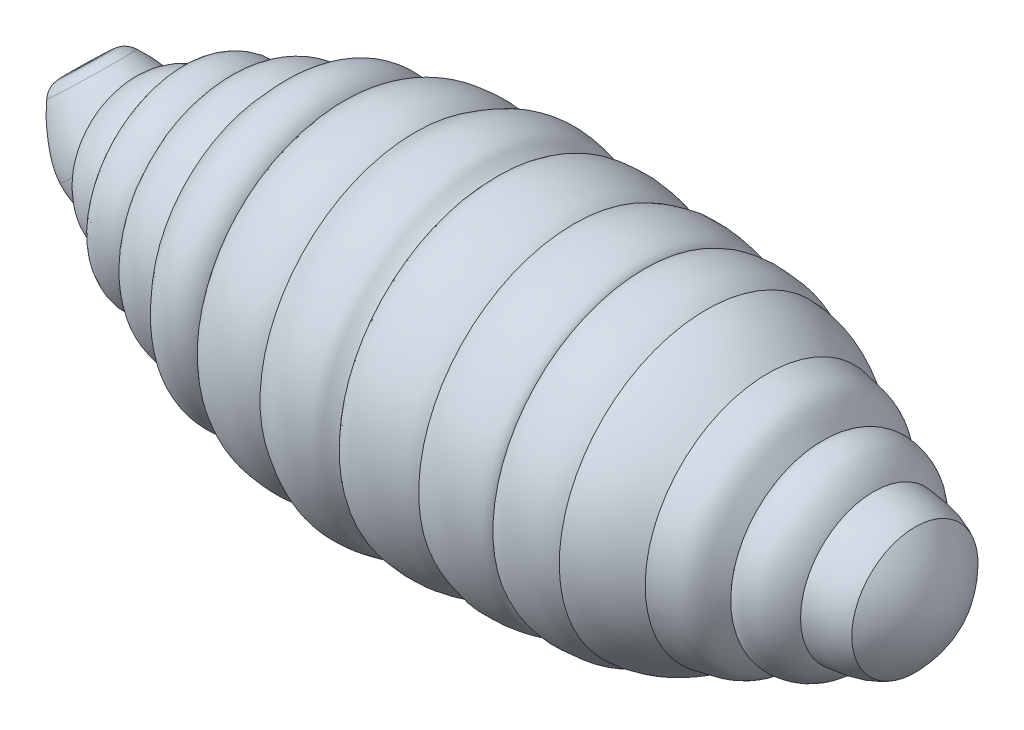
ISO-10303-21;
HEADER;
FILE_DESCRIPTION(('STEP AP214'),'2;1');
FILE_NAME('part.step','',(''),(''),'','','');
FILE_SCHEMA(('AUTOMOTIVE_DESIGN { 1 0 10303 214 1 1 1 1 }'));
ENDSEC;
DATA;
#1=APPLICATION_CONTEXT('core data for automotive mechanical design processes');
#2=APPLICATION_PROTOCOL_DEFINITION('international standard','automotive_design',2000,#1);
#3=PRODUCT_CONTEXT('',#1,'mechanical');
#4=PRODUCT('Part','Part','',(#3));
#5=PRODUCT_RELATED_PRODUCT_CATEGORY('part','',(#4));
#6=PRODUCT_DEFINITION_FORMATION('','',#4);
#7=PRODUCT_DEFINITION_CONTEXT('part definition',#1,'design');
#8=PRODUCT_DEFINITION('design','',#6,#7);
#9=PRODUCT_DEFINITION_SHAPE('','',#8);
#10=(LENGTH_UNIT() NAMED_UNIT(*) SI_UNIT(.MILLI.,.METRE.));
#11=(NAMED_UNIT(*) PLANE_ANGLE_UNIT() SI_UNIT($,.RADIAN.));
#12=(NAMED_UNIT(*) SI_UNIT($,.STERADIAN.) SOLID_ANGLE_UNIT());
#13=UNCERTAINTY_MEASURE_WITH_UNIT(LENGTH_MEASURE(1.E-05),#10,'distance_accuracy_value','');
#14=(GEOMETRIC_REPRESENTATION_CONTEXT(3) GLOBAL_UNCERTAINTY_ASSIGNED_CONTEXT((#13)) GLOBAL_UNIT_ASSIGNED_CONTEXT((#10,
#11,#12)) REPRESENTATION_CONTEXT('',''));
#15=CARTESIAN_POINT('',(0.,0.,0.));
#16=DIRECTION('',(0.,0.,1.));
#17=DIRECTION('',(1.,0.,0.));
#18=AXIS2_PLACEMENT_3D('',#15,#16,#17);
#19=CARTESIAN_POINT('',(-42.,0.,0.));
#20=DIRECTION('',(0.,0.,-1.));
#21=DIRECTION('',(1.,0.,0.));
#22=AXIS2_PLACEMENT_3D('',#19,#20,#21);
#23=SPHERICAL_SURFACE('',#22,6.5);
#24=CARTESIAN_POINT('',(-42.2629997102586,0.279961247403764,0.));
#25=DIRECTION('',(-0.684683498236419,0.728840522503201,0.));
#26=DIRECTION('',(-0.728840522503201,-0.684683498236419,0.));
#27=AXIS2_PLACEMENT_3D('',#24,#25,#26);
#28=CIRCLE('',#27,6.48864029303181);
#29=CARTESIAN_POINT('',(-42.,0.527027040369689,-6.47859880674159));
#30=VERTEX_POINT('',#29);
#31=CARTESIAN_POINT('',(-42.,0.52702704039308,6.47859880674012));
#32=VERTEX_POINT('',#31);
#33=EDGE_CURVE('E110',#30,#32,#28,.T.);
#34=ORIENTED_EDGE('',*,*,#33,.F.);
#35=CARTESIAN_POINT('',(-42.,0.,0.));
#36=DIRECTION('',(1.,0.,0.));
#37=DIRECTION('',(0.,1.,0.));
#38=AXIS2_PLACEMENT_3D('',#35,#36,#37);
#39=CIRCLE('',#38,6.5);
#40=CARTESIAN_POINT('',(-42.,-4.72764270550133,-4.4608737315822));
#41=VERTEX_POINT('',#40);
#42=EDGE_CURVE('E39',#41,#30,#39,.T.);
#43=ORIENTED_EDGE('',*,*,#42,.F.);
#44=CARTESIAN_POINT('',(-39.6407877272752,-2.51136402436704,0.));
#45=DIRECTION('',(-0.684683498236419,0.728840522503201,0.));
#46=DIRECTION('',(-0.728840522503201,-0.684683498236419,0.));
#47=AXIS2_PLACEMENT_3D('',#44,#45,#46);
#48=CIRCLE('',#47,5.51154861988351);
#49=CARTESIAN_POINT('',(-42.,-4.72764270550082,4.46087373158273));
#50=VERTEX_POINT('',#49);
#51=EDGE_CURVE('E61',#50,#41,#48,.F.);
#52=ORIENTED_EDGE('',*,*,#51,.F.);
#53=EDGE_CURVE('E96',#32,#50,#39,.T.);
#54=ORIENTED_EDGE('',*,*,#53,.F.);
#55=EDGE_LOOP('',(#34,#43,#52,#54));
#56=FACE_BOUND('',#55,.T.);
#57=ADVANCED_FACE('F35',(#56),#23,.T.);
#58=CARTESIAN_POINT('',(50.,0.,0.));
#59=CARTESIAN_POINT('',(49.9997063551662,1.83528020877926,0.));
#60=CARTESIAN_POINT('',(49.1652497316057,3.63930144569189,0.));
#61=CARTESIAN_POINT('',(48.3309716119096,5.44293677307604,0.));
#62=CARTESIAN_POINT('',(46.6888712468462,7.15708657704143,0.));
#63=B_SPLINE_CURVE_WITH_KNOTS('',2,(#58,#59,#60,#61,#62),.UNSPECIFIED.,.F.,.F.,(3,2,3),(0.,0.5,
1.),.UNSPECIFIED.);
#64=CARTESIAN_POINT('',(-50.,0.,0.));
#65=DIRECTION('',(-1.,0.,0.));
#66=AXIS1_PLACEMENT('',#64,#65);
#67=SURFACE_OF_REVOLUTION('',#63,#66);
#68=CARTESIAN_POINT('',(46.6888712468464,0.,0.));
#69=DIRECTION('',(-1.,0.,0.));
#70=DIRECTION('',(0.,1.,0.));
#71=AXIS2_PLACEMENT_3D('',#68,#69,#70);
#72=CIRCLE('',#71,7.15708657704127);
#73=CARTESIAN_POINT('',(46.6888712468464,7.15708657704127,0.));
#74=VERTEX_POINT('',#73);
#75=EDGE_CURVE('E192',#74,#74,#72,.T.);
#76=ORIENTED_EDGE('',*,*,#75,.F.);
#77=EDGE_LOOP('',(#76));
#78=FACE_BOUND('',#77,.T.);
#79=CARTESIAN_POINT('',(50.,0.,0.));
#80=VERTEX_POINT('',#79);
#81=VERTEX_LOOP('',#80);
#82=FACE_BOUND('',#81,.T.);
#83=ADVANCED_FACE('F168',(#78,#82),#67,.T.);
#84=CARTESIAN_POINT('',(42.,8.28104738789359,0.));
#85=CARTESIAN_POINT('',(43.5955919784813,8.09543828768739,0.));
#86=CARTESIAN_POINT('',(45.2531179201532,7.96065524423312,0.));
#87=CARTESIAN_POINT('',(46.6888712468464,7.15708657704127,0.));
#88=B_SPLINE_CURVE_WITH_KNOTS('',3,(#84,#85,#86,#87),.UNSPECIFIED.,.F.,.F.,(4,4),(0.,1.),.UNSPECIFIED.);
#89=CARTESIAN_POINT('',(-50.,0.,0.));
#90=DIRECTION('',(-1.,0.,0.));
#91=AXIS1_PLACEMENT('',#89,#90);
#92=SURFACE_OF_REVOLUTION('',#88,#91);
#93=ORIENTED_EDGE('',*,*,#75,.T.);
#94=EDGE_LOOP('',(#93));
#95=FACE_BOUND('',#94,.T.);
#96=CARTESIAN_POINT('',(42.,0.,0.));
#97=DIRECTION('',(-1.,0.,0.));
#98=DIRECTION('',(0.,-1.,0.));
#99=AXIS2_PLACEMENT_3D('',#96,#97,#98);
#100=CIRCLE('',#99,8.28104738789359);
#101=CARTESIAN_POINT('',(42.,-8.28104738789358,0.));
#102=VERTEX_POINT('',#101);
#103=EDGE_CURVE('E256',#102,#102,#100,.T.);
#104=ORIENTED_EDGE('',*,*,#103,.F.);
#105=EDGE_LOOP('',(#104));
#106=FACE_BOUND('',#105,.T.);
#107=ADVANCED_FACE('F172',(#95,#106),#92,.F.);
#108=CARTESIAN_POINT('',(36.,10.0967700152084,0.));
#109=CARTESIAN_POINT('',(36.1648997740849,10.4394423191181,0.));
#110=CARTESIAN_POINT('',(36.6963517795307,10.8691492370424,0.));
#111=CARTESIAN_POINT('',(37.745862760455,11.0782128664449,0.));
#112=CARTESIAN_POINT('',(38.6875001009525,10.8757792862498,0.));
#113=CARTESIAN_POINT('',(39.765691934058,10.5497597271227,0.));
#114=CARTESIAN_POINT('',(40.8970845261141,9.68208773770644,0.));
#115=CARTESIAN_POINT('',(41.6422223563437,8.85342200247426,0.));
#116=CARTESIAN_POINT('',(42.,8.28104738789359,0.));
#117=B_SPLINE_CURVE_WITH_KNOTS('',3,(#108,#109,#110,#111,#112,#113,#114,#115,#116),
.UNSPECIFIED.,.F.,.F.,(4,1,1,1,1,1,4),(0.,0.152464572931677,0.266191497924167,0.427434588880055,
0.541585927712012,0.725793911544838,1.),.UNSPECIFIED.);
#118=CARTESIAN_POINT('',(-50.,0.,0.));
#119=DIRECTION('',(-1.,0.,0.));
#120=AXIS1_PLACEMENT('',#118,#119);
#121=SURFACE_OF_REVOLUTION('',#117,#120);
#122=ORIENTED_EDGE('',*,*,#103,.T.);
#123=EDGE_LOOP('',(#122));
#124=FACE_BOUND('',#123,.T.);
#125=CARTESIAN_POINT('',(36.,0.,0.));
#126=DIRECTION('',(-1.,0.,0.));
#127=DIRECTION('',(0.,-1.,0.));
#128=AXIS2_PLACEMENT_3D('',#125,#126,#127);
#129=CIRCLE('',#128,10.0967700152084);
#130=CARTESIAN_POINT('',(36.,-10.0967700152084,0.));
#131=VERTEX_POINT('',#130);
#132=EDGE_CURVE('E253',#131,#131,#129,.T.);
#133=ORIENTED_EDGE('',*,*,#132,.F.);
#134=EDGE_LOOP('',(#133));
#135=FACE_BOUND('',#134,.T.);
#136=ADVANCED_FACE('F271',(#124,#135),#121,.F.);
#137=CARTESIAN_POINT('',(30.,13.9037401965799,0.));
#138=CARTESIAN_POINT('',(31.1983333416806,13.6198257245417,0.));
#139=CARTESIAN_POINT('',(34.0789157247043,13.5061248181912,0.));
#140=CARTESIAN_POINT('',(35.3497922038353,11.0047350326224,0.));
#141=CARTESIAN_POINT('',(36.,10.0967700152084,0.));
#142=B_SPLINE_CURVE_WITH_KNOTS('',3,(#137,#138,#139,#140,#141),.UNSPECIFIED.,.F.,.F.,(4,1,4),
(0.,0.529447084413405,1.),.UNSPECIFIED.);
#143=CARTESIAN_POINT('',(-50.,0.,0.));
#144=DIRECTION('',(-1.,0.,0.));
#145=AXIS1_PLACEMENT('',#143,#144);
#146=SURFACE_OF_REVOLUTION('',#142,#145);
#147=ORIENTED_EDGE('',*,*,#132,.T.);
#148=EDGE_LOOP('',(#147));
#149=FACE_BOUND('',#148,.T.);
#150=CARTESIAN_POINT('',(30.,0.,0.));
#151=DIRECTION('',(-1.,0.,0.));
#152=DIRECTION('',(0.,-1.,0.));
#153=AXIS2_PLACEMENT_3D('',#150,#151,#152);
#154=CIRCLE('',#153,13.9037401965799);
#155=CARTESIAN_POINT('',(30.,-13.9037401965799,0.));
#156=VERTEX_POINT('',#155);
#157=EDGE_CURVE('E250',#156,#156,#154,.T.);
#158=ORIENTED_EDGE('',*,*,#157,.F.);
#159=EDGE_LOOP('',(#158));
#160=FACE_BOUND('',#159,.T.);
#161=ADVANCED_FACE('F276',(#149,#160),#146,.F.);
#162=CARTESIAN_POINT('',(23.,16.6479798239174,0.));
#163=CARTESIAN_POINT('',(25.6210132962743,16.5633102642351,0.));
#164=CARTESIAN_POINT('',(27.9044349307184,15.3073779247023,0.));
#165=CARTESIAN_POINT('',(30.,13.9037401965799,0.));
#166=B_SPLINE_CURVE_WITH_KNOTS('',3,(#162,#163,#164,#165),.UNSPECIFIED.,.F.,.F.,(4,4),(0.,1.),.UNSPECIFIED.);
#167=CARTESIAN_POINT('',(-50.,0.,0.));
#168=DIRECTION('',(-1.,0.,0.));
#169=AXIS1_PLACEMENT('',#167,#168);
#170=SURFACE_OF_REVOLUTION('',#166,#169);
#171=ORIENTED_EDGE('',*,*,#157,.T.);
#172=EDGE_LOOP('',(#171));
#173=FACE_BOUND('',#172,.T.);
#174=CARTESIAN_POINT('',(23.,0.,0.));
#175=DIRECTION('',(-1.,0.,0.));
#176=DIRECTION('',(0.,-1.,0.));
#177=AXIS2_PLACEMENT_3D('',#174,#175,#176);
#178=CIRCLE('',#177,16.6479798239174);
#179=CARTESIAN_POINT('',(23.,-16.6479798239174,0.));
#180=VERTEX_POINT('',#179);
#181=EDGE_CURVE('E247',#180,#180,#178,.T.);
#182=ORIENTED_EDGE('',*,*,#181,.F.);
#183=EDGE_LOOP('',(#182));
#184=FACE_BOUND('',#183,.T.);
#185=ADVANCED_FACE('F281',(#173,#184),#170,.F.);
#186=CARTESIAN_POINT('',(16.,17.1727696263886,0.));
#187=CARTESIAN_POINT('',(16.4092306846909,17.3968524585221,0.));
#188=CARTESIAN_POINT('',(17.0185438711078,17.5894532577867,0.));
#189=CARTESIAN_POINT('',(17.9071210774252,17.6388000058519,0.));
#190=CARTESIAN_POINT('',(18.2046930613381,17.6823657132867,0.));
#191=CARTESIAN_POINT('',(18.607659449331,17.6808848623169,0.));
#192=CARTESIAN_POINT('',(18.9514869908962,17.6412399103501,0.));
#193=CARTESIAN_POINT('',(20.3135688490514,17.5548759143627,0.));
#194=CARTESIAN_POINT('',(21.4096312816424,17.4389186139164,0.));
#195=CARTESIAN_POINT('',(22.5448340930615,16.9224433203292,0.));
#196=CARTESIAN_POINT('',(23.,16.6479798239174,0.));
#197=B_SPLINE_CURVE_WITH_KNOTS('',3,(#186,#187,#188,#189,#190,#191,#192,#193,#194,#195,#196),
.UNSPECIFIED.,.F.,.F.,(4,1,1,1,1,1,1,1,4),(0.,0.20115166025893,0.294305631612312,
0.364002236395487,0.3814152572732,0.468435840389441,0.54569185567994,0.779325231246277,1.),.UNSPECIFIED.);
#198=CARTESIAN_POINT('',(-50.,0.,0.));
#199=DIRECTION('',(-1.,0.,0.));
#200=AXIS1_PLACEMENT('',#198,#199);
#201=SURFACE_OF_REVOLUTION('',#197,#200);
#202=ORIENTED_EDGE('',*,*,#181,.T.);
#203=EDGE_LOOP('',(#202));
#204=FACE_BOUND('',#203,.T.);
#205=CARTESIAN_POINT('',(16.,0.,0.));
#206=DIRECTION('',(-1.,0.,0.));
#207=DIRECTION('',(0.,-1.,0.));
#208=AXIS2_PLACEMENT_3D('',#205,#206,#207);
#209=CIRCLE('',#208,17.1727696263885);
#210=CARTESIAN_POINT('',(16.,-17.1727696263885,0.));
#211=VERTEX_POINT('',#210);
#212=EDGE_CURVE('E244',#211,#211,#209,.T.);
#213=ORIENTED_EDGE('',*,*,#212,.F.);
#214=EDGE_LOOP('',(#213));
#215=FACE_BOUND('',#214,.T.);
#216=ADVANCED_FACE('F287',(#204,#215),#201,.F.);
#217=CARTESIAN_POINT('',(7.99999999999998,17.58879558299,0.));
#218=CARTESIAN_POINT('',(8.58195172244521,17.8804159787155,0.));
#219=CARTESIAN_POINT('',(9.43998916263691,18.0527990013269,0.));
#220=CARTESIAN_POINT('',(10.5081521326243,18.3341251335839,0.));
#221=CARTESIAN_POINT('',(11.0618501999922,18.2976534538103,0.));
#222=CARTESIAN_POINT('',(11.5040455510617,18.2994251244907,0.));
#223=CARTESIAN_POINT('',(11.8663632179127,18.3093296074904,0.));
#224=CARTESIAN_POINT('',(12.2606155330468,18.2674280029491,0.));
#225=CARTESIAN_POINT('',(12.6390768169979,18.2311689979446,0.));
#226=CARTESIAN_POINT('',(12.9995380189958,18.1871859247805,0.));
#227=CARTESIAN_POINT('',(13.4294768607219,18.1315994240063,0.));
#228=CARTESIAN_POINT('',(14.0354190365389,18.0081948464241,0.));
#229=CARTESIAN_POINT('',(14.9736986439508,17.8254983824232,0.));
#230=CARTESIAN_POINT('',(15.7088977452917,17.5561704027527,0.));
#231=CARTESIAN_POINT('',(16.,17.1727696263885,0.));
#232=B_SPLINE_CURVE_WITH_KNOTS('',3,(#217,#218,#219,#220,#221,#222,#223,#224,#225,#226,#227,
#228,#229,#230,#231),.UNSPECIFIED.,.F.,.F.,(4,1,1,1,1,1,1,1,1,1,1,1,4),(0.,0.229372754582656,
0.317536007236325,0.393855893615315,0.427343111732747,0.476843965174335,0.524044558774018,
0.569820456887553,0.613701787293404,0.654707151740502,0.725801780216515,0.83593387589124,1.),.UNSPECIFIED.);
#233=CARTESIAN_POINT('',(-50.,0.,0.));
#234=DIRECTION('',(-1.,0.,0.));
#235=AXIS1_PLACEMENT('',#233,#234);
#236=SURFACE_OF_REVOLUTION('',#232,#235);
#237=ORIENTED_EDGE('',*,*,#212,.T.);
#238=EDGE_LOOP('',(#237));
#239=FACE_BOUND('',#238,.T.);
#240=CARTESIAN_POINT('',(7.99999999999999,0.,0.));
#241=DIRECTION('',(-1.,0.,0.));
#242=DIRECTION('',(0.,-1.,0.));
#243=AXIS2_PLACEMENT_3D('',#240,#241,#242);
#244=CIRCLE('',#243,17.58879558299);
#245=CARTESIAN_POINT('',(7.99999999999999,-17.58879558299,0.));
#246=VERTEX_POINT('',#245);
#247=EDGE_CURVE('E241',#246,#246,#244,.T.);
#248=ORIENTED_EDGE('',*,*,#247,.F.);
#249=EDGE_LOOP('',(#248));
#250=FACE_BOUND('',#249,.T.);
#251=ADVANCED_FACE('F293',(#239,#250),#236,.F.);
#252=CARTESIAN_POINT('',(-1.00000000000002,17.58879558299,0.));
#253=CARTESIAN_POINT('',(-0.614381517490259,18.1042013550658,0.));
#254=CARTESIAN_POINT('',(0.333735079944588,18.632641408761,0.));
#255=CARTESIAN_POINT('',(1.65279448140818,18.7237738313502,0.));
#256=CARTESIAN_POINT('',(2.53495210967577,18.794772533689,0.));
#257=CARTESIAN_POINT('',(3.2722451551941,18.7961807507217,0.));
#258=CARTESIAN_POINT('',(3.89160746997234,18.7458650543614,0.));
#259=CARTESIAN_POINT('',(4.47522000834908,18.667212173481,0.));
#260=CARTESIAN_POINT('',(4.99223252068978,18.5615601771135,0.));
#261=CARTESIAN_POINT('',(5.54256250629083,18.4666664859525,0.));
#262=CARTESIAN_POINT('',(6.11477590126522,18.2846224684002,0.));
#263=CARTESIAN_POINT('',(6.6811895763478,18.1832914009895,0.));
#264=CARTESIAN_POINT('',(7.33054937110865,17.9804058142008,0.));
#265=CARTESIAN_POINT('',(7.73759263743826,17.748797975174,0.));
#266=CARTESIAN_POINT('',(7.99999999999998,17.58879558299,0.));
#267=B_SPLINE_CURVE_WITH_KNOTS('',3,(#252,#253,#254,#255,#256,#257,#258,#259,#260,#261,#262,
#263,#264,#265,#266),.UNSPECIFIED.,.F.,.F.,(4,1,1,1,1,1,1,1,1,1,1,1,4),(0.,0.199993369543529,
0.323104104368617,0.414620343601679,0.47925154603547,0.555247359146551,0.610372734943505,
0.664792721977809,0.721612681011752,0.786226372903281,0.853650458042409,0.902782427386736,1.),.UNSPECIFIED.);
#268=CARTESIAN_POINT('',(-50.,0.,0.));
#269=DIRECTION('',(-1.,0.,0.));
#270=AXIS1_PLACEMENT('',#268,#269);
#271=SURFACE_OF_REVOLUTION('',#267,#270);
#272=ORIENTED_EDGE('',*,*,#247,.T.);
#273=EDGE_LOOP('',(#272));
#274=FACE_BOUND('',#273,.T.);
#275=CARTESIAN_POINT('',(-1.00000000000001,0.,0.));
#276=DIRECTION('',(-1.,0.,0.));
#277=DIRECTION('',(0.,-1.,0.));
#278=AXIS2_PLACEMENT_3D('',#275,#276,#277);
#279=CIRCLE('',#278,17.58879558299);
#280=CARTESIAN_POINT('',(-1.00000000000001,-17.58879558299,0.));
#281=VERTEX_POINT('',#280);
#282=EDGE_CURVE('E238',#281,#281,#279,.T.);
#283=ORIENTED_EDGE('',*,*,#282,.F.);
#284=EDGE_LOOP('',(#283));
#285=FACE_BOUND('',#284,.T.);
#286=ADVANCED_FACE('F299',(#274,#285),#271,.F.);
#287=CARTESIAN_POINT('',(-10.,17.58879558299,0.));
#288=CARTESIAN_POINT('',(-9.17764033625155,18.0865379526265,0.));
#289=CARTESIAN_POINT('',(-7.79833975548958,19.0069684286883,0.));
#290=CARTESIAN_POINT('',(-5.52354150623839,19.3180077940493,0.));
#291=CARTESIAN_POINT('',(-3.93611691289387,19.069156303444,0.));
#292=CARTESIAN_POINT('',(-2.28921186726228,18.7528788819492,0.));
#293=CARTESIAN_POINT('',(-1.61636299261944,17.8471970558595,0.));
#294=CARTESIAN_POINT('',(-1.00000000000002,17.58879558299,0.));
#295=B_SPLINE_CURVE_WITH_KNOTS('',3,(#287,#288,#289,#290,#291,#292,#293,#294),.UNSPECIFIED.,.F.,
.F.,(4,1,1,1,1,4),(0.,0.297871953056791,0.496695395077748,0.687344485397055,0.793867051889781,
1.),.UNSPECIFIED.);
#296=CARTESIAN_POINT('',(-50.,0.,0.));
#297=DIRECTION('',(-1.,0.,0.));
#298=AXIS1_PLACEMENT('',#296,#297);
#299=SURFACE_OF_REVOLUTION('',#295,#298);
#300=ORIENTED_EDGE('',*,*,#282,.T.);
#301=EDGE_LOOP('',(#300));
#302=FACE_BOUND('',#301,.T.);
#303=CARTESIAN_POINT('',(-10.,0.,0.));
#304=DIRECTION('',(-1.,0.,0.));
#305=DIRECTION('',(0.,-1.,0.));
#306=AXIS2_PLACEMENT_3D('',#303,#304,#305);
#307=CIRCLE('',#306,17.58879558299);
#308=CARTESIAN_POINT('',(-10.,-17.58879558299,0.));
#309=VERTEX_POINT('',#308);
#310=EDGE_CURVE('E235',#309,#309,#307,.T.);
#311=ORIENTED_EDGE('',*,*,#310,.F.);
#312=EDGE_LOOP('',(#311));
#313=FACE_BOUND('',#312,.T.);
#314=ADVANCED_FACE('F305',(#302,#313),#299,.F.);
#315=CARTESIAN_POINT('',(-19.,14.7813768868694,0.));
#316=CARTESIAN_POINT('',(-18.8759341950245,16.028850536088,0.));
#317=CARTESIAN_POINT('',(-17.5747081904575,17.2884400085088,0.));
#318=CARTESIAN_POINT('',(-15.5097710752355,18.0753626090936,0.));
#319=CARTESIAN_POINT('',(-14.0238921132705,18.2272210447954,0.));
#320=CARTESIAN_POINT('',(-12.1615104618129,18.3929705347466,0.));
#321=CARTESIAN_POINT('',(-10.7975743860364,18.0401145274624,0.));
#322=CARTESIAN_POINT('',(-10.,17.58879558299,0.));
#323=B_SPLINE_CURVE_WITH_KNOTS('',3,(#315,#316,#317,#318,#319,#320,#321,#322),.UNSPECIFIED.,.F.,
.F.,(4,1,1,1,1,4),(0.,0.324864627047122,0.474838109363639,0.616409351822741,0.743385769950866,
1.),.UNSPECIFIED.);
#324=CARTESIAN_POINT('',(-50.,0.,0.));
#325=DIRECTION('',(-1.,0.,0.));
#326=AXIS1_PLACEMENT('',#324,#325);
#327=SURFACE_OF_REVOLUTION('',#323,#326);
#328=ORIENTED_EDGE('',*,*,#310,.T.);
#329=EDGE_LOOP('',(#328));
#330=FACE_BOUND('',#329,.T.);
#331=CARTESIAN_POINT('',(-19.,0.,0.));
#332=DIRECTION('',(-1.,0.,0.));
#333=DIRECTION('',(0.,-1.,0.));
#334=AXIS2_PLACEMENT_3D('',#331,#332,#333);
#335=CIRCLE('',#334,14.7813768868694);
#336=CARTESIAN_POINT('',(-19.,-14.7813768868694,0.));
#337=VERTEX_POINT('',#336);
#338=EDGE_CURVE('E232',#337,#337,#335,.T.);
#339=ORIENTED_EDGE('',*,*,#338,.F.);
#340=EDGE_LOOP('',(#339));
#341=FACE_BOUND('',#340,.T.);
#342=ADVANCED_FACE('F311',(#330,#341),#327,.F.);
#343=CARTESIAN_POINT('',(-26.,13.9037401965799,0.));
#344=CARTESIAN_POINT('',(-25.2518993592873,14.6965988482443,0.));
#345=CARTESIAN_POINT('',(-24.2034123378488,16.1921795650815,0.));
#346=CARTESIAN_POINT('',(-22.1096612303888,16.6701797300599,0.));
#347=CARTESIAN_POINT('',(-20.3650098145285,16.3823642915235,0.));
#348=CARTESIAN_POINT('',(-19.344111288408,15.542594260465,0.));
#349=CARTESIAN_POINT('',(-19.,14.7813768868694,0.));
#350=B_SPLINE_CURVE_WITH_KNOTS('',3,(#343,#344,#345,#346,#347,#348,#349),.UNSPECIFIED.,.F.,.F.,
(4,1,1,1,4),(0.,0.396544676610702,0.574715816439164,0.715438823067215,1.),.UNSPECIFIED.);
#351=CARTESIAN_POINT('',(-50.,0.,0.));
#352=DIRECTION('',(-1.,0.,0.));
#353=AXIS1_PLACEMENT('',#351,#352);
#354=SURFACE_OF_REVOLUTION('',#350,#353);
#355=ORIENTED_EDGE('',*,*,#338,.T.);
#356=EDGE_LOOP('',(#355));
#357=FACE_BOUND('',#356,.T.);
#358=CARTESIAN_POINT('',(-26.,0.,0.));
#359=DIRECTION('',(-1.,0.,0.));
#360=DIRECTION('',(0.,-1.,0.));
#361=AXIS2_PLACEMENT_3D('',#358,#359,#360);
#362=CIRCLE('',#361,13.9037401965799);
#363=CARTESIAN_POINT('',(-26.,-13.9037401965799,0.));
#364=VERTEX_POINT('',#363);
#365=EDGE_CURVE('E227',#364,#364,#362,.T.);
#366=ORIENTED_EDGE('',*,*,#365,.F.);
#367=EDGE_LOOP('',(#366));
#368=FACE_BOUND('',#367,.T.);
#369=ADVANCED_FACE('F317',(#357,#368),#354,.F.);
#370=CARTESIAN_POINT('',(-32.,11.2075803757034,0.));
#371=CARTESIAN_POINT('',(-31.4638772632166,12.0955660328105,0.));
#372=CARTESIAN_POINT('',(-30.5043649253966,13.362444513894,0.));
#373=CARTESIAN_POINT('',(-28.2234485828988,14.2013610857232,0.));
#374=CARTESIAN_POINT('',(-26.870161366585,13.9918896528299,0.));
#375=CARTESIAN_POINT('',(-26.,13.9037401965799,0.));
#376=B_SPLINE_CURVE_WITH_KNOTS('',3,(#370,#371,#372,#373,#374,#375),.UNSPECIFIED.,.F.,.F.,(4,1,
1,4),(0.,0.44747716248506,0.624963351203104,1.),.UNSPECIFIED.);
#377=CARTESIAN_POINT('',(-50.,0.,0.));
#378=DIRECTION('',(-1.,0.,0.));
#379=AXIS1_PLACEMENT('',#377,#378);
#380=SURFACE_OF_REVOLUTION('',#376,#379);
#381=ORIENTED_EDGE('',*,*,#365,.T.);
#382=EDGE_LOOP('',(#381));
#383=FACE_BOUND('',#382,.T.);
#384=CARTESIAN_POINT('',(-32.,0.,0.));
#385=DIRECTION('',(-1.,0.,0.));
#386=DIRECTION('',(0.,-1.,0.));
#387=AXIS2_PLACEMENT_3D('',#384,#385,#386);
#388=CIRCLE('',#387,11.2075803757034);
#389=CARTESIAN_POINT('',(-32.,-11.2075803757034,0.));
#390=VERTEX_POINT('',#389);
#391=EDGE_CURVE('E224',#390,#390,#388,.T.);
#392=ORIENTED_EDGE('',*,*,#391,.F.);
#393=EDGE_LOOP('',(#392));
#394=FACE_BOUND('',#393,.T.);
#395=ADVANCED_FACE('F323',(#383,#394),#380,.F.);
#396=CARTESIAN_POINT('',(-37.,8.66945288548921,0.));
#397=CARTESIAN_POINT('',(-36.8749721801821,9.4102597841531,0.));
#398=CARTESIAN_POINT('',(-36.7552599978338,10.8605923923989,0.));
#399=CARTESIAN_POINT('',(-35.5564071743559,11.468057962562,0.));
#400=CARTESIAN_POINT('',(-34.9943321818747,11.7036733380231,0.));
#401=CARTESIAN_POINT('',(-34.3972152975765,11.7224176467875,0.));
#402=CARTESIAN_POINT('',(-33.846437797095,11.7326233010398,0.));
#403=CARTESIAN_POINT('',(-33.3520670008097,11.6817834967057,0.));
#404=CARTESIAN_POINT('',(-32.9352788683238,11.6252589245461,0.));
#405=CARTESIAN_POINT('',(-32.4910962335332,11.487967975443,0.));
#406=CARTESIAN_POINT('',(-32.1900861183029,11.3250953267541,0.));
#407=CARTESIAN_POINT('',(-32.,11.2075803757034,0.));
#408=B_SPLINE_CURVE_WITH_KNOTS('',3,(#396,#397,#398,#399,#400,#401,#402,#403,#404,#405,#406,
#407),.UNSPECIFIED.,.F.,.F.,(4,1,1,1,1,1,1,1,1,4),(0.,0.382043088140238,0.470299160207412,
0.564740486421525,0.641238461850231,0.723825005855344,0.80148270744285,0.854067904932874,
0.90400214142157,1.),.UNSPECIFIED.);
#409=CARTESIAN_POINT('',(-50.,0.,0.));
#410=DIRECTION('',(-1.,0.,0.));
#411=AXIS1_PLACEMENT('',#409,#410);
#412=SURFACE_OF_REVOLUTION('',#408,#411);
#413=ORIENTED_EDGE('',*,*,#391,.T.);
#414=EDGE_LOOP('',(#413));
#415=FACE_BOUND('',#414,.T.);
#416=CARTESIAN_POINT('',(-37.,0.,0.));
#417=DIRECTION('',(-1.,0.,0.));
#418=DIRECTION('',(0.,-1.,0.));
#419=AXIS2_PLACEMENT_3D('',#416,#417,#418);
#420=CIRCLE('',#419,8.66945288548922);
#421=CARTESIAN_POINT('',(-37.,-8.66945288548922,0.));
#422=VERTEX_POINT('',#421);
#423=EDGE_CURVE('E222',#422,#422,#420,.T.);
#424=ORIENTED_EDGE('',*,*,#423,.F.);
#425=EDGE_LOOP('',(#424));
#426=FACE_BOUND('',#425,.T.);
#427=ADVANCED_FACE('F144',(#415,#426),#412,.F.);
#428=CARTESIAN_POINT('',(-37.,8.66945288548921,0.));
#429=CARTESIAN_POINT('',(-37.5687261972869,8.83838966750022,0.));
#430=CARTESIAN_POINT('',(-38.6222432728673,8.89558611511547,0.));
#431=CARTESIAN_POINT('',(-39.9274606609751,8.43873614810949,0.));
#432=CARTESIAN_POINT('',(-41.0572077508054,7.84938849370961,0.));
#433=CARTESIAN_POINT('',(-41.6675767088784,7.25274902199846,0.));
#434=CARTESIAN_POINT('',(-42.,6.89388489648067,0.));
#435=B_SPLINE_CURVE_WITH_KNOTS('',3,(#428,#429,#430,#431,#432,#433,#434),.UNSPECIFIED.,.F.,.F.,
(4,1,1,1,4),(0.,0.318968187039639,0.548467596683686,0.735630309419928,1.),.UNSPECIFIED.);
#436=CARTESIAN_POINT('',(-50.,0.,0.));
#437=DIRECTION('',(-1.,0.,0.));
#438=AXIS1_PLACEMENT('',#436,#437);
#439=SURFACE_OF_REVOLUTION('',#435,#438);
#440=CARTESIAN_POINT('',(-42.,0.,0.));
#441=DIRECTION('',(-1.,0.,0.));
#442=DIRECTION('',(0.,-1.,0.));
#443=AXIS2_PLACEMENT_3D('',#440,#441,#442);
#444=CIRCLE('',#443,6.89388489648067);
#445=CARTESIAN_POINT('',(-42.,5.55294283060381,-4.08539776349501));
#446=VERTEX_POINT('',#445);
#447=CARTESIAN_POINT('',(-42.,5.55294283060379,4.08539776349503));
#448=VERTEX_POINT('',#447);
#449=EDGE_CURVE('E163',#446,#448,#444,.T.);
#450=ORIENTED_EDGE('',*,*,#449,.F.);
#451=CARTESIAN_POINT('',(-42.0000000000007,5.5529428305691,-4.08539776353654));
#452=CARTESIAN_POINT('',(-41.9878110237277,5.63498333279106,-3.99609693016261));
#453=CARTESIAN_POINT('',(-41.9756147302684,5.71465125079751,-3.90460426870246));
#454=CARTESIAN_POINT('',(-41.9513784859169,5.86895391048275,-3.71733216226805));
#455=CARTESIAN_POINT('',(-41.9393386617188,5.94358475649876,-3.62154949252675));
#456=CARTESIAN_POINT('',(-41.9156029062932,6.08741460284883,-3.42590973502914));
#457=CARTESIAN_POINT('',(-41.9039070516122,6.15661239975386,-3.32605175198704));
#458=CARTESIAN_POINT('',(-41.8810008449011,6.28946140521121,-3.12210947401983));
#459=CARTESIAN_POINT('',(-41.8697925062367,6.35309054208494,-3.01801056367029));
#460=CARTESIAN_POINT('',(-41.8480933987521,6.47414757099719,-2.80621981488165));
#461=CARTESIAN_POINT('',(-41.8376024691136,6.53157685451149,-2.69852878977756));
#462=CARTESIAN_POINT('',(-41.8175136466212,6.63991036303921,-2.47984964895232));
#463=CARTESIAN_POINT('',(-41.8079156824953,6.69081510893097,-2.36886179730167));
#464=CARTESIAN_POINT('',(-41.7854158720069,6.80864982714281,-2.0897697612534));
#465=CARTESIAN_POINT('',(-41.7731455924012,6.87150978516986,-1.9198720496655));
#466=CARTESIAN_POINT('',(-41.751424514716,6.98133019917128,-1.5748270895373));
#467=CARTESIAN_POINT('',(-41.7419739530207,7.02828932218198,-1.39967940223165));
#468=CARTESIAN_POINT('',(-41.7263053124233,7.10549887342242,-1.0460370109467));
#469=CARTESIAN_POINT('',(-41.7200793510036,7.13579005777076,-0.867551584439676));
#470=CARTESIAN_POINT('',(-41.7110934973594,7.17935285661551,-0.508440770967639));
#471=CARTESIAN_POINT('',(-41.7083331644683,7.1926266349382,-0.327815659019865));
#472=CARTESIAN_POINT('',(-41.7065017407427,7.20144019691338,0.0140864422593439));
#473=CARTESIAN_POINT('',(-41.7070600568944,7.19876134203521,0.175318155967095));
#474=CARTESIAN_POINT('',(-41.7109974104129,7.17978209518877,0.496940303140446));
#475=CARTESIAN_POINT('',(-41.7143763308567,7.16348226785323,0.657330771201036));
#476=CARTESIAN_POINT('',(-41.7238412046309,7.1174570896019,0.97617676131729));
#477=CARTESIAN_POINT('',(-41.7299286394071,7.08772439132097,1.13463117563225));
#478=CARTESIAN_POINT('',(-41.7446045663449,7.0152035140486,1.44839953257789));
#479=CARTESIAN_POINT('',(-41.7531930512633,6.97241537286562,1.60371348430195));
#480=CARTESIAN_POINT('',(-41.7724377060409,6.87506078886436,1.90779575558862));
#481=CARTESIAN_POINT('',(-41.783059699383,6.82068754901724,2.05662826562796));
#482=CARTESIAN_POINT('',(-41.806128095523,6.70038427451256,2.34939931225745));
#483=CARTESIAN_POINT('',(-41.8185745718652,6.63445377396501,2.49333765127705));
#484=CARTESIAN_POINT('',(-41.8449205097506,6.49174824899288,2.77551060651305));
#485=CARTESIAN_POINT('',(-41.8588193866541,6.41497758375835,2.91374748674315));
#486=CARTESIAN_POINT('',(-41.8876817571375,6.25132464668933,3.18392578931185));
#487=CARTESIAN_POINT('',(-41.9026449594015,6.16444513763273,3.3158689179174));
#488=CARTESIAN_POINT('',(-41.9313019190302,5.99291936159344,3.55670787962684));
#489=CARTESIAN_POINT('',(-41.9449166042733,5.9093825206379,3.66640693749792));
#490=CARTESIAN_POINT('',(-41.9723576462734,5.73588440575952,3.88013319132305));
#491=CARTESIAN_POINT('',(-41.9861834129942,5.64593912040365,3.98417343475801));
#492=CARTESIAN_POINT('',(-42.,5.55294283060379,4.08539776349503));
#493=B_SPLINE_CURVE_WITH_KNOTS('',3,(#451,#452,#453,#454,#455,#456,#457,#458,#459,#460,#461,
#462,#463,#464,#465,#466,#467,#468,#469,#470,#471,#472,#473,#474,#475,#476,#477,#478,#479,#480,
#481,#482,#483,#484,#485,#486,#487,#488,#489,#490,#491,#492),.UNSPECIFIED.,.F.,.F.,(4,2,2,2,2,2,
2,2,2,2,2,2,2,2,2,2,2,2,2,2,4),(0.,0.365600858247084,0.731481306063092,1.09744256967819,
1.46479421047853,1.83206323186003,2.19930291448891,2.74319352631949,3.2871297211051,
3.82972991555364,4.37226110953028,4.85543471503605,5.33858829244961,5.82200646048111,
6.30542322855151,6.78133377844523,7.25726351739948,7.73300241139911,8.20861158856519,
8.62401615397109,9.03841834747898),.UNSPECIFIED.);
#494=EDGE_CURVE('E53',#446,#448,#493,.T.);
#495=ORIENTED_EDGE('',*,*,#494,.T.);
#496=EDGE_LOOP('',(#450,#495));
#497=FACE_BOUND('',#496,.T.);
#498=ORIENTED_EDGE('',*,*,#423,.T.);
#499=EDGE_LOOP('',(#498));
#500=FACE_BOUND('',#499,.T.);
#501=ADVANCED_FACE('F139',(#497,#500),#439,.T.);
#502=CARTESIAN_POINT('',(-42.,0.,0.));
#503=DIRECTION('',(1.,0.,0.));
#504=DIRECTION('',(0.,1.,0.));
#505=AXIS2_PLACEMENT_3D('',#502,#503,#504);
#506=PLANE('',#505);
#507=ORIENTED_EDGE('',*,*,#449,.T.);
#508=CARTESIAN_POINT('',(-42.,6.97661151523843,1.85639530265215));
#509=CARTESIAN_POINT('',(-42.,6.91741507000373,2.01638623245473));
#510=CARTESIAN_POINT('',(-42.,6.85105648319547,2.17360176844363));
#511=CARTESIAN_POINT('',(-42.,6.7052703077877,2.48164760003692));
#512=CARTESIAN_POINT('',(-42.,6.62585751595012,2.6324848846921));
#513=CARTESIAN_POINT('',(-42.,6.37069317695393,3.07298137268837));
#514=CARTESIAN_POINT('',(-42.,6.17729300343312,3.3525163442446));
#515=CARTESIAN_POINT('',(-42.,5.69516682655198,3.95188913375951));
#516=CARTESIAN_POINT('',(-42.,5.39479307239403,4.26233761393885));
#517=CARTESIAN_POINT('',(-42.,4.90937591125205,4.68837781509345));
#518=CARTESIAN_POINT('',(-42.,4.74135552005026,4.82403835080093));
#519=CARTESIAN_POINT('',(-42.,4.39503762683633,5.08150098249153));
#520=CARTESIAN_POINT('',(-42.,4.21674069131463,5.20330384127491));
#521=CARTESIAN_POINT('',(-42.,3.66508275075326,5.54878388633503));
#522=CARTESIAN_POINT('',(-42.,3.27738680961634,5.75040605651464));
#523=CARTESIAN_POINT('',(-42.,2.67575889683199,6.00237971714193));
#524=CARTESIAN_POINT('',(-42.,2.47197224919656,6.07793666077418));
#525=CARTESIAN_POINT('',(-42.,2.05857499337708,6.21125454147452));
#526=CARTESIAN_POINT('',(-42.,1.84896446205099,6.26901571327244));
#527=CARTESIAN_POINT('',(-42.,1.4227882050059,6.36605161109026));
#528=CARTESIAN_POINT('',(-42.,1.20616899521767,6.4050940326071));
#529=CARTESIAN_POINT('',(-42.,0.879249567127807,6.44808345939571));
#530=CARTESIAN_POINT('',(-42.,0.769932309635422,6.45981800880658));
#531=CARTESIAN_POINT('',(-42.,0.550854945561711,6.47794864759784));
#532=CARTESIAN_POINT('',(-42.,0.441094834867373,6.48434468728145));
#533=CARTESIAN_POINT('',(-42.,0.111531893889254,6.49547167014595));
#534=CARTESIAN_POINT('',(-42.,-0.108593847745631,6.49214680042546));
#535=CARTESIAN_POINT('',(-42.,-0.54746599175376,6.4642690453052));
#536=CARTESIAN_POINT('',(-42.,-0.766212367351228,6.43971574909653));
#537=CARTESIAN_POINT('',(-42.,-1.17413616597838,6.37390824110738));
#538=CARTESIAN_POINT('',(-42.,-1.36369883246065,6.33502453622619));
#539=CARTESIAN_POINT('',(-42.,-1.73890851906527,6.2413065393595));
#540=CARTESIAN_POINT('',(-42.,-1.9245543209862,6.18646736119281));
#541=CARTESIAN_POINT('',(-42.,-2.29045349903013,6.06115387738333));
#542=CARTESIAN_POINT('',(-42.,-2.47070792596732,5.99068264136522));
#543=CARTESIAN_POINT('',(-42.,-2.824471113844,5.8344678956799));
#544=CARTESIAN_POINT('',(-42.,-2.99798015870129,5.74872502965591));
#545=CARTESIAN_POINT('',(-42.,-3.33461318444264,5.56366059127746));
#546=CARTESIAN_POINT('',(-42.,-3.497844319814,5.46453402855876));
#547=CARTESIAN_POINT('',(-42.,-3.81497477886254,5.25245514033363));
#548=CARTESIAN_POINT('',(-42.,-3.96887793374081,5.13950854934386));
#549=CARTESIAN_POINT('',(-42.,-4.26604376537503,4.90049829798611));
#550=CARTESIAN_POINT('',(-42.,-4.40931065050615,4.77443987339544));
#551=CARTESIAN_POINT('',(-42.,-4.68400203889799,4.51002054315868));
#552=CARTESIAN_POINT('',(-42.,-4.81542703903859,4.37166015418163));
#553=CARTESIAN_POINT('',(-42.,-5.05969400792618,4.09008036328431));
#554=CARTESIAN_POINT('',(-42.,-5.17310327823414,3.94735270306909));
#555=CARTESIAN_POINT('',(-42.,-5.38714802480505,3.65262220423266));
#556=CARTESIAN_POINT('',(-42.,-5.48778383182688,3.50061960592973));
#557=CARTESIAN_POINT('',(-42.,-5.67557918870411,3.18840046105566));
#558=CARTESIAN_POINT('',(-42.,-5.76273170162731,3.02817968310711));
#559=CARTESIAN_POINT('',(-42.,-5.92291241133383,2.70083469202781));
#560=CARTESIAN_POINT('',(-42.,-5.99594102744472,2.53371068402746));
#561=CARTESIAN_POINT('',(-42.,-6.12591835213365,2.19784653672485));
#562=CARTESIAN_POINT('',(-42.,-6.18320494072107,2.02923691968493));
#563=CARTESIAN_POINT('',(-42.,-6.28370964828757,1.68779349553167));
#564=CARTESIAN_POINT('',(-42.,-6.32692126067139,1.51495777434815));
#565=CARTESIAN_POINT('',(-42.,-6.39903338364283,1.16673636349191));
#566=CARTESIAN_POINT('',(-42.,-6.42796553006324,0.991357204920207));
#567=CARTESIAN_POINT('',(-42.,-6.47160967695913,0.638833349217568));
#568=CARTESIAN_POINT('',(-42.,-6.48632220828762,0.461688718245503));
#569=CARTESIAN_POINT('',(-42.,-6.4979738477399,0.189559497064469));
#570=CARTESIAN_POINT('',(-42.,-6.50000126445773,0.0947728634485135));
#571=CARTESIAN_POINT('',(-42.,-6.5,0.));
#572=B_SPLINE_CURVE_WITH_KNOTS('',3,(#508,#509,#510,#511,#512,#513,#514,#515,#516,#517,#518,
#519,#520,#521,#522,#523,#524,#525,#526,#527,#528,#529,#530,#531,#532,#533,#534,#535,#536,#537,
#538,#539,#540,#541,#542,#543,#544,#545,#546,#547,#548,#549,#550,#551,#552,#553,#554,#555,#556,
#557,#558,#559,#560,#561,#562,#563,#564,#565,#566,#567,#568,#569,#570,#571),.UNSPECIFIED.,.F.,
.F.,(4,2,2,2,2,2,2,2,2,2,2,2,2,2,2,2,2,2,2,2,2,2,2,2,2,2,2,2,2,2,2,4),(0.,0.511406730366233,
1.02223773547223,2.03790248192345,3.32681216567023,3.97409985514012,4.6213518971962,
5.92544502234719,6.57686229282051,7.22827097060005,7.88756699041669,8.21728881150389,
8.54701370197332,9.20634205493874,9.86568316739988,10.4455291781775,11.0255529474025,
11.6054629196069,12.1853484565129,12.7575490999526,13.3295131131287,13.9012496018829,
14.4729620896626,15.0191825568737,15.5653888772444,16.111879308015,16.6583535114159,
17.1919712136671,17.7258352483364,18.258511149827,18.7911671644548,19.075499450269),.UNSPECIFIED.);
#573=EDGE_CURVE('E88',#448,#32,#572,.T.);
#574=ORIENTED_EDGE('',*,*,#573,.T.);
#575=ORIENTED_EDGE('',*,*,#53,.T.);
#576=CARTESIAN_POINT('',(-42.,-6.50000000000007,0.));
#577=VERTEX_POINT('',#576);
#578=EDGE_CURVE('E83',#50,#577,#572,.T.);
#579=ORIENTED_EDGE('',*,*,#578,.T.);
#580=CARTESIAN_POINT('',(-42.,-4.72764270550133,-4.46087373158219));
#581=CARTESIAN_POINT('',(-42.0000037615361,-4.8089021638494,-4.3761140302471));
#582=CARTESIAN_POINT('',(-42.0000538990197,-4.8878081833238,-4.28909738205093));
#583=CARTESIAN_POINT('',(-42.0001756104075,-5.03881047349946,-4.11297837982623));
#584=CARTESIAN_POINT('',(-42.0002466348427,-5.11102549791118,-4.023977815515));
#585=CARTESIAN_POINT('',(-42.0003444678927,-5.24883671786553,-3.84435495290135));
#586=CARTESIAN_POINT('',(-42.0003722940679,-5.31454995985226,-3.75382244967983));
#587=CARTESIAN_POINT('',(-42.0003529699767,-5.43959120923777,-3.57154834676298));
#588=CARTESIAN_POINT('',(-42.0003075573546,-5.49903257871567,-3.47988449604578));
#589=CARTESIAN_POINT('',(-42.0001348804751,-5.61179043845288,-3.29569703074218));
#590=CARTESIAN_POINT('',(-42.0000094859836,-5.66521485637532,-3.20323946984504));
#591=CARTESIAN_POINT('',(-41.9996910283421,-5.76621813071735,-3.01774919279499));
#592=CARTESIAN_POINT('',(-41.9994994741999,-5.81389778499976,-2.92477134252997));
#593=CARTESIAN_POINT('',(-41.9990780885315,-5.90369960739789,-2.73845776512212));
#594=CARTESIAN_POINT('',(-41.9988490994386,-5.94591387435251,-2.64516641009116));
#595=CARTESIAN_POINT('',(-41.9983916049327,-6.02507199057376,-2.45837518426031));
#596=CARTESIAN_POINT('',(-41.9981631666122,-6.0620977998962,-2.36491003104207));
#597=CARTESIAN_POINT('',(-41.9977484686355,-6.13115515474847,-2.17785341059063));
#598=CARTESIAN_POINT('',(-41.9975615917495,-6.1632572228812,-2.08428796762634));
#599=CARTESIAN_POINT('',(-41.9972679701816,-6.22272260975506,-1.89704821624055));
#600=CARTESIAN_POINT('',(-41.997160181571,-6.2501438551139,-1.80339229677967));
#601=CARTESIAN_POINT('',(-41.9970522035359,-6.30047304040432,-1.61592836154349));
#602=CARTESIAN_POINT('',(-41.9970508979116,-6.32342528299635,-1.52213223401114));
#603=CARTESIAN_POINT('',(-41.9971661838921,-6.36500288681945,-1.3342897713755));
#604=CARTESIAN_POINT('',(-41.9972819326447,-6.38365801030726,-1.24025001972444));
#605=CARTESIAN_POINT('',(-41.9976184041992,-6.41678048538347,-1.05177484958512));
#606=CARTESIAN_POINT('',(-41.9978387591643,-6.43126222766471,-0.957341958059344));
#607=CARTESIAN_POINT('',(-41.9983418155948,-6.45612231376779,-0.76789694588104));
#608=CARTESIAN_POINT('',(-41.9986245436715,-6.46649890084418,-0.672884594878859));
#609=CARTESIAN_POINT('',(-41.9991780738235,-6.48317185771176,-0.482069892143758));
#610=CARTESIAN_POINT('',(-41.9994488162217,-6.48944957429064,-0.386265910725301));
#611=CARTESIAN_POINT('',(-41.9998574145223,-6.49788185720911,-0.193642418514532));
#612=CARTESIAN_POINT('',(-41.9999940956321,-6.5000001327311,-0.0968213154553069));
#613=CARTESIAN_POINT('',(-42.,-6.5,0.));
#614=B_SPLINE_CURVE_WITH_KNOTS('',3,(#580,#581,#582,#583,#584,#585,#586,#587,#588,#589,#590,
#591,#592,#593,#594,#595,#596,#597,#598,#599,#600,#601,#602,#603,#604,#605,#606,#607,#608,#609,
#610,#611,#612,#613),.UNSPECIFIED.,.F.,.F.,(4,2,2,2,2,2,2,2,2,2,2,2,2,2,2,2,4),(0.,
0.35221326848524,0.695883124384306,1.03132771796261,1.35893004671624,1.67914135416329,
1.99248491506083,2.29955980390384,2.60104416082986,2.89769740698353,3.19036083670787,
3.4799560460413,3.76748076325745,4.05400183566594,4.34064538859166,4.62858447645488,
4.9190248415129),.UNSPECIFIED.);
#615=EDGE_CURVE('E79',#577,#41,#614,.F.);
#616=ORIENTED_EDGE('',*,*,#615,.T.);
#617=ORIENTED_EDGE('',*,*,#42,.T.);
#618=CARTESIAN_POINT('',(-42.,-6.5,0.));
#619=CARTESIAN_POINT('',(-42.,-6.50000475993165,-0.183423801015098));
#620=CARTESIAN_POINT('',(-42.,-6.49240924800143,-0.366853698360191));
#621=CARTESIAN_POINT('',(-42.,-6.46204254162794,-0.732483008205692));
#622=CARTESIAN_POINT('',(-42.,-6.43926879375321,-0.914682208455704));
#623=CARTESIAN_POINT('',(-42.,-6.3785522444089,-1.27665365169701));
#624=CARTESIAN_POINT('',(-42.,-6.34060033013497,-1.45642436950248));
#625=CARTESIAN_POINT('',(-42.,-6.24962780242727,-1.8121038063975));
#626=CARTESIAN_POINT('',(-42.,-6.19660821915354,-1.98801278862427));
#627=CARTESIAN_POINT('',(-42.,-6.07560121270685,-2.33494227576888));
#628=CARTESIAN_POINT('',(-42.,-6.00758881458814,-2.50595407948116));
#629=CARTESIAN_POINT('',(-42.,-5.85700392242943,-2.84144443828778));
#630=CARTESIAN_POINT('',(-42.,-5.77443160058249,-3.00592307061852));
#631=CARTESIAN_POINT('',(-42.,-5.59533855245813,-3.32690993308671));
#632=CARTESIAN_POINT('',(-42.,-5.49883045786989,-3.48342520947816));
#633=CARTESIAN_POINT('',(-42.,-5.29252068300258,-3.78742990121652));
#634=CARTESIAN_POINT('',(-42.,-5.18271936594461,-3.93491956301165));
#635=CARTESIAN_POINT('',(-42.,-4.95424381251792,-4.21542177271847));
#636=CARTESIAN_POINT('',(-42.,-4.83594319904611,-4.34873897112248));
#637=CARTESIAN_POINT('',(-42.,-4.58854024563759,-4.60502811296203));
#638=CARTESIAN_POINT('',(-42.,-4.45943422436629,-4.72799650177205));
#639=CARTESIAN_POINT('',(-42.,-4.19145165685947,-4.96278895140761));
#640=CARTESIAN_POINT('',(-42.,-4.05257458167934,-5.07461240812218));
#641=CARTESIAN_POINT('',(-42.,-3.76606313120585,-5.28651770144287));
#642=CARTESIAN_POINT('',(-42.,-3.61842561711777,-5.38659529088559));
#643=CARTESIAN_POINT('',(-42.,-3.31351129190377,-5.575697047847));
#644=CARTESIAN_POINT('',(-42.,-3.15613243626314,-5.66455660423789));
#645=CARTESIAN_POINT('',(-42.,-2.83461699377387,-5.82924628655292));
#646=CARTESIAN_POINT('',(-42.,-2.67047744739499,-5.90507062945588));
#647=CARTESIAN_POINT('',(-42.,-2.33664421661491,-6.04329235350834));
#648=CARTESIAN_POINT('',(-42.,-2.16695058652064,-6.10568986589803));
#649=CARTESIAN_POINT('',(-42.,-1.82313259189205,-6.2167763228957));
#650=CARTESIAN_POINT('',(-42.,-1.64900806562083,-6.26546476630932));
#651=CARTESIAN_POINT('',(-42.,-1.2892298178569,-6.3508453108195));
#652=CARTESIAN_POINT('',(-42.,-1.10341749918335,-6.38687075479213));
#653=CARTESIAN_POINT('',(-42.,-0.729450831555763,-6.44341537345916));
#654=CARTESIAN_POINT('',(-42.,-0.541296410978063,-6.46393407275279));
#655=CARTESIAN_POINT('',(-42.,-0.164003211765836,-6.48926474799615));
#656=CARTESIAN_POINT('',(-42.,0.0251350106178943,-6.49408479951929));
#657=CARTESIAN_POINT('',(-42.,0.308596248310299,-6.48944084835319));
#658=CARTESIAN_POINT('',(-42.,0.403049255851259,-6.48591316299735));
#659=CARTESIAN_POINT('',(-42.,0.591722826917431,-6.47488127147475));
#660=CARTESIAN_POINT('',(-42.,0.685943388094535,-6.46737702530181));
#661=CARTESIAN_POINT('',(-42.,0.969916219368164,-6.43881232449064));
#662=CARTESIAN_POINT('',(-42.,1.15910003902621,-6.41173166002909));
#663=CARTESIAN_POINT('',(-42.,1.53459581248062,-6.34243013198725));
#664=CARTESIAN_POINT('',(-42.,1.72090751089932,-6.30020793008781));
#665=CARTESIAN_POINT('',(-42.,2.27430990946398,-6.15196618438869));
#666=CARTESIAN_POINT('',(-42.,2.63590059245408,-6.0243679841293));
#667=CARTESIAN_POINT('',(-42.,3.17465207368156,-5.78906351265078));
#668=CARTESIAN_POINT('',(-42.,3.36000759612044,-5.69929243946599));
#669=CARTESIAN_POINT('',(-42.,3.72330377751257,-5.50584191559468));
#670=CARTESIAN_POINT('',(-42.,3.90124692874679,-5.4021671900564));
#671=CARTESIAN_POINT('',(-42.,4.24908166098723,-5.18141941090681));
#672=CARTESIAN_POINT('',(-42.,4.41895699101937,-5.06432081238637));
#673=CARTESIAN_POINT('',(-42.,4.74927673608899,-4.81748569720513));
#674=CARTESIAN_POINT('',(-42.,4.90972089117306,-4.68774883245485));
#675=CARTESIAN_POINT('',(-42.,5.23621104798143,-4.40186642616651));
#676=CARTESIAN_POINT('',(-42.,5.40108653655751,-4.24437803573959));
#677=CARTESIAN_POINT('',(-42.,5.71581298156041,-3.91489951733833));
#678=CARTESIAN_POINT('',(-42.,5.86565933209728,-3.74290497329824));
#679=CARTESIAN_POINT('',(-42.,6.14726907763358,-3.38586151406526));
#680=CARTESIAN_POINT('',(-42.,6.27910761811562,-3.20087205084548));
#681=CARTESIAN_POINT('',(-42.,6.52268033853468,-2.81824979905259));
#682=CARTESIAN_POINT('',(-42.,6.63443673983355,-2.62063131727842));
#683=CARTESIAN_POINT('',(-42.,6.77984477259723,-2.32608465833519));
#684=CARTESIAN_POINT('',(-42.,6.82263326380922,-2.23359401543875));
#685=CARTESIAN_POINT('',(-42.,6.90333561299579,-2.04652525950677));
#686=CARTESIAN_POINT('',(-42.,6.94125008395298,-1.9519474107257));
#687=CARTESIAN_POINT('',(-42.,6.97661151523843,-1.85639530265216));
#688=B_SPLINE_CURVE_WITH_KNOTS('',3,(#618,#619,#620,#621,#622,#623,#624,#625,#626,#627,#628,
#629,#630,#631,#632,#633,#634,#635,#636,#637,#638,#639,#640,#641,#642,#643,#644,#645,#646,#647,
#648,#649,#650,#651,#652,#653,#654,#655,#656,#657,#658,#659,#660,#661,#662,#663,#664,#665,#666,
#667,#668,#669,#670,#671,#672,#673,#674,#675,#676,#677,#678,#679,#680,#681,#682,#683,#684,#685,
#686,#687),.UNSPECIFIED.,.F.,.F.,(4,2,2,2,2,2,2,2,2,2,2,2,2,2,2,2,2,2,2,2,2,2,2,2,2,2,2,2,2,2,2,
2,2,2,4),(0.,0.550124524720544,1.10034162014354,1.650889556983,2.2013998625137,2.7528342294391,
3.3042620752591,3.85519319628616,4.40610926718743,4.94019211675293,5.47445767152607,
6.0087521704278,6.54323927240683,7.08483107349472,7.62666253304298,8.16848869623375,
8.71033466565411,9.27749282641443,9.84466837422113,10.4115521139778,10.6950357253844,
10.9785221888317,11.5511171047914,12.1237626433315,13.2689561575554,13.8863551255724,
14.5035448001261,15.1219290845803,15.7403304057034,16.4234390826133,17.1067564721447,
17.7871291094267,18.4667441991486,18.7723520581074,19.0779214445227),.UNSPECIFIED.);
#689=EDGE_CURVE('E132',#30,#446,#688,.T.);
#690=ORIENTED_EDGE('',*,*,#689,.T.);
#691=EDGE_LOOP('',(#507,#574,#575,#579,#616,#617,#690));
#692=FACE_BOUND('',#691,.T.);
#693=ADVANCED_FACE('F93',(#692),#506,.F.);
#694=CARTESIAN_POINT('',(-47.297713505635,5.63937686458742,0.));
#695=CARTESIAN_POINT('',(-47.8588189223647,5.03130858783427,0.));
#696=CARTESIAN_POINT('',(-48.7647331660054,4.40834215795551,0.));
#697=CARTESIAN_POINT('',(-49.7069479944678,3.20007229277215,0.));
#698=CARTESIAN_POINT('',(-49.721245936394,1.86346223238418,0.));
#699=CARTESIAN_POINT('',(-49.2918372167898,0.369883500994216,0.));
#700=CARTESIAN_POINT('',(-48.5225375009271,-1.79658357920939,0.));
#701=CARTESIAN_POINT('',(-46.848079514287,-5.01676500828135,0.));
#702=CARTESIAN_POINT('',(-43.8822141709944,-6.53935908193373,0.));
#703=CARTESIAN_POINT('',(-42.,-6.5,0.));
#704=B_SPLINE_CURVE_WITH_KNOTS('',3,(#694,#695,#696,#697,#698,#699,#700,#701,#702,#703),
.UNSPECIFIED.,.F.,.F.,(4,1,1,1,1,1,1,4),(0.,0.144470229966498,0.196446460046314,
0.261798802444104,0.369333338578501,0.472449494837954,0.668415236695375,1.),.UNSPECIFIED.);
#705=CARTESIAN_POINT('',(-47.297713505635,5.63937686458742,0.));
#706=DIRECTION('',(-0.684683498236419,0.728840522503201,0.));
#707=AXIS1_PLACEMENT('',#705,#706);
#708=SURFACE_OF_REVOLUTION('',#704,#707);
#709=CARTESIAN_POINT('',(-46.6612470433797,4.96186302045254,0.));
#710=DIRECTION('',(-0.684683498236419,0.728840522503201,0.));
#711=DIRECTION('',(-0.728840522503201,-0.684683498236419,0.));
#712=AXIS2_PLACEMENT_3D('',#709,#710,#711);
#713=CIRCLE('',#712,4.13987931492184);
#714=CARTESIAN_POINT('',(-49.6785588463676,2.12735596883527,0.));
#715=VERTEX_POINT('',#714);
#716=EDGE_CURVE('E45',#715,#715,#713,.F.);
#717=ORIENTED_EDGE('',*,*,#716,.T.);
#718=EDGE_LOOP('',(#717));
#719=FACE_BOUND('',#718,.T.);
#720=ORIENTED_EDGE('',*,*,#573,.F.);
#721=ORIENTED_EDGE('',*,*,#494,.F.);
#722=ORIENTED_EDGE('',*,*,#689,.F.);
#723=ORIENTED_EDGE('',*,*,#33,.T.);
#724=EDGE_LOOP('',(#720,#721,#722,#723));
#725=FACE_BOUND('',#724,.T.);
#726=ADVANCED_FACE('F121',(#719,#725),#708,.F.);
#727=CARTESIAN_POINT('',(-45.9283465091621,4.18169581958102,0.));
#728=DIRECTION('',(-0.68468349823642,0.7288405225032,0.));
#729=DIRECTION('',(-0.7288405225032,-0.68468349823642,0.));
#730=AXIS2_PLACEMENT_3D('',#727,#728,#729);
#731=TOROIDAL_SURFACE('',#730,2.45044273853673,2.);
#732=ORIENTED_EDGE('',*,*,#716,.F.);
#733=EDGE_LOOP('',(#732));
#734=FACE_BOUND('',#733,.T.);
#735=CARTESIAN_POINT('',(-47.297713505635,5.63937686458742,0.));
#736=DIRECTION('',(-0.68468349823642,0.7288405225032,0.));
#737=DIRECTION('',(-0.7288405225032,-0.68468349823642,0.));
#738=AXIS2_PLACEMENT_3D('',#735,#736,#737);
#739=CIRCLE('',#738,2.45044273853673);
#740=CARTESIAN_POINT('',(-49.0836954715542,3.96159915813806,0.));
#741=VERTEX_POINT('',#740);
#742=EDGE_CURVE('E189',#741,#741,#739,.T.);
#743=ORIENTED_EDGE('',*,*,#742,.F.);
#744=EDGE_LOOP('',(#743));
#745=FACE_BOUND('',#744,.T.);
#746=ADVANCED_FACE('F37',(#734,#745),#731,.T.);
#747=CARTESIAN_POINT('',(-47.297713505635,5.63937686458742,0.));
#748=DIRECTION('',(-0.684683498236419,0.728840522503201,0.));
#749=DIRECTION('',(-0.728840522503201,-0.684683498236419,0.));
#750=AXIS2_PLACEMENT_3D('',#747,#748,#749);
#751=CIRCLE('',#750,1.18280657318281);
#752=CARTESIAN_POINT('',(-48.1597908664537,4.82952872232358,0.));
#753=VERTEX_POINT('',#752);
#754=EDGE_CURVE('E11',#753,#753,#751,.F.);
#755=ORIENTED_EDGE('',*,*,#754,.T.);
#756=EDGE_LOOP('',(#755));
#757=FACE_BOUND('',#756,.T.);
#758=ORIENTED_EDGE('',*,*,#742,.T.);
#759=EDGE_LOOP('',(#758));
#760=FACE_BOUND('',#759,.T.);
#761=ADVANCED_FACE('F122',(#757,#760),#708,.F.);
#762=CARTESIAN_POINT('',(-47.297713505635,5.63937686458742,0.));
#763=DIRECTION('',(-0.68468349823642,0.7288405225032,0.));
#764=DIRECTION('',(-0.7288405225032,-0.68468349823642,0.));
#765=AXIS2_PLACEMENT_3D('',#762,#763,#764);
#766=PLANE('',#765);
#767=CARTESIAN_POINT('',(-47.297713505635,5.63937686458742,0.));
#768=VERTEX_POINT('',#767);
#769=VERTEX_LOOP('',#768);
#770=FACE_BOUND('',#769,.T.);
#771=ORIENTED_EDGE('',*,*,#754,.F.);
#772=EDGE_LOOP('',(#771));
#773=FACE_BOUND('',#772,.T.);
#774=ADVANCED_FACE('F120',(#770,#773),#766,.T.);
#775=ORIENTED_EDGE('',*,*,#578,.F.);
#776=ORIENTED_EDGE('',*,*,#51,.T.);
#777=ORIENTED_EDGE('',*,*,#615,.F.);
#778=EDGE_LOOP('',(#775,#776,#777));
#779=FACE_BOUND('',#778,.T.);
#780=ADVANCED_FACE('F82',(#779),#708,.F.);
#781=CLOSED_SHELL('',(#57,#83,#107,#136,#161,#185,#216,#251,#286,#314,#342,#369,#395,#427,#501,
#693,#726,#746,#761,#774,#780));
#782=MANIFOLD_SOLID_BREP('B2',#781);
#783=ADVANCED_BREP_SHAPE_REPRESENTATION('',(#18,#782),#14);
#784=SHAPE_DEFINITION_REPRESENTATION(#9,#783);
ENDSEC;
END-ISO-10303-21;
